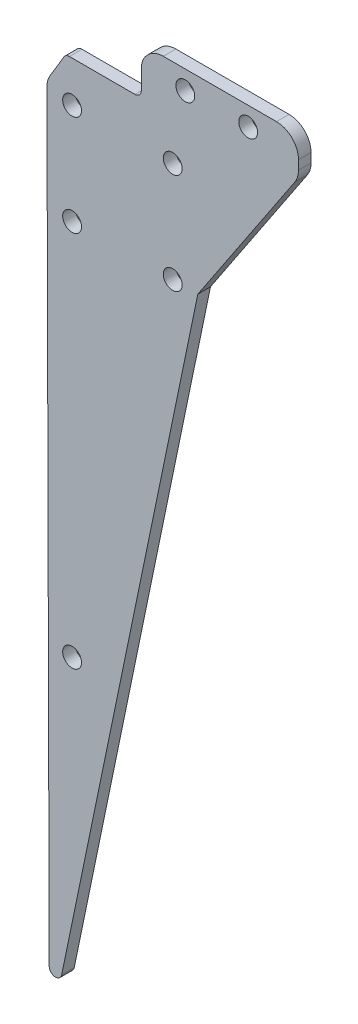
ISO-10303-21;
HEADER;
FILE_DESCRIPTION(('STEP AP214'),'2;1');
FILE_NAME('part.step','',(''),(''),'','','');
FILE_SCHEMA(('AUTOMOTIVE_DESIGN { 1 0 10303 214 1 1 1 1 }'));
ENDSEC;
DATA;
#1=APPLICATION_CONTEXT('core data for automotive mechanical design processes');
#2=APPLICATION_PROTOCOL_DEFINITION('international standard','automotive_design',2000,#1);
#3=PRODUCT_CONTEXT('',#1,'mechanical');
#4=PRODUCT('Part','Part','',(#3));
#5=PRODUCT_RELATED_PRODUCT_CATEGORY('part','',(#4));
#6=PRODUCT_DEFINITION_FORMATION('','',#4);
#7=PRODUCT_DEFINITION_CONTEXT('part definition',#1,'design');
#8=PRODUCT_DEFINITION('design','',#6,#7);
#9=PRODUCT_DEFINITION_SHAPE('','',#8);
#10=(LENGTH_UNIT() NAMED_UNIT(*) SI_UNIT(.MILLI.,.METRE.));
#11=(NAMED_UNIT(*) PLANE_ANGLE_UNIT() SI_UNIT($,.RADIAN.));
#12=(NAMED_UNIT(*) SI_UNIT($,.STERADIAN.) SOLID_ANGLE_UNIT());
#13=UNCERTAINTY_MEASURE_WITH_UNIT(LENGTH_MEASURE(1.E-05),#10,'distance_accuracy_value','');
#14=(GEOMETRIC_REPRESENTATION_CONTEXT(3) GLOBAL_UNCERTAINTY_ASSIGNED_CONTEXT((#13)) GLOBAL_UNIT_ASSIGNED_CONTEXT((#10,
#11,#12)) REPRESENTATION_CONTEXT('',''));
#15=CARTESIAN_POINT('',(0.,0.,0.));
#16=DIRECTION('',(0.,0.,1.));
#17=DIRECTION('',(1.,0.,0.));
#18=AXIS2_PLACEMENT_3D('',#15,#16,#17);
#19=CARTESIAN_POINT('',(0.,0.,2.));
#20=DIRECTION('',(0.,-1.,0.));
#21=DIRECTION('',(0.,0.,-1.));
#22=AXIS2_PLACEMENT_3D('',#19,#20,#21);
#23=PLANE('',#22);
#24=DIRECTION('',(-1.,0.,0.));
#25=VECTOR('',#24,1.);
#26=CARTESIAN_POINT('',(0.,0.,0.));
#27=LINE('',#26,#25);
#28=CARTESIAN_POINT('',(21.5,0.,0.));
#29=VERTEX_POINT('',#28);
#30=CARTESIAN_POINT('',(3.5,0.,0.));
#31=VERTEX_POINT('',#30);
#32=EDGE_CURVE('E317',#29,#31,#27,.T.);
#33=ORIENTED_EDGE('',*,*,#32,.T.);
#34=DIRECTION('',(0.,0.,-1.));
#35=VECTOR('',#34,1.);
#36=CARTESIAN_POINT('',(3.5,0.,2.));
#37=LINE('',#36,#35);
#38=CARTESIAN_POINT('',(3.5,0.,2.));
#39=VERTEX_POINT('',#38);
#40=EDGE_CURVE('E218',#31,#39,#37,.F.);
#41=ORIENTED_EDGE('',*,*,#40,.T.);
#42=DIRECTION('',(-1.,0.,0.));
#43=VECTOR('',#42,1.);
#44=CARTESIAN_POINT('',(0.,0.,2.));
#45=LINE('',#44,#43);
#46=CARTESIAN_POINT('',(21.5,0.,2.));
#47=VERTEX_POINT('',#46);
#48=EDGE_CURVE('E302',#47,#39,#45,.T.);
#49=ORIENTED_EDGE('',*,*,#48,.F.);
#50=DIRECTION('',(0.,0.,-1.));
#51=VECTOR('',#50,1.);
#52=CARTESIAN_POINT('',(21.5,0.,2.));
#53=LINE('',#52,#51);
#54=EDGE_CURVE('E349',#47,#29,#53,.T.);
#55=ORIENTED_EDGE('',*,*,#54,.T.);
#56=EDGE_LOOP('',(#33,#41,#49,#55));
#57=FACE_BOUND('',#56,.T.);
#58=ADVANCED_FACE('F39',(#57),#23,.F.);
#59=CARTESIAN_POINT('',(0.,0.,2.));
#60=DIRECTION('',(1.,0.,0.));
#61=DIRECTION('',(0.,1.,0.));
#62=AXIS2_PLACEMENT_3D('',#59,#60,#61);
#63=PLANE('',#62);
#64=DIRECTION('',(0.,-1.,0.));
#65=VECTOR('',#64,1.);
#66=CARTESIAN_POINT('',(0.,0.,0.));
#67=LINE('',#66,#65);
#68=CARTESIAN_POINT('',(0.,-3.5,0.));
#69=VERTEX_POINT('',#68);
#70=CARTESIAN_POINT('',(0.,-6.5,0.));
#71=VERTEX_POINT('',#70);
#72=EDGE_CURVE('E316',#69,#71,#67,.T.);
#73=ORIENTED_EDGE('',*,*,#72,.T.);
#74=DIRECTION('',(0.,0.,-1.));
#75=VECTOR('',#74,1.);
#76=CARTESIAN_POINT('',(0.,-6.5,2.));
#77=LINE('',#76,#75);
#78=CARTESIAN_POINT('',(0.,-6.5,2.));
#79=VERTEX_POINT('',#78);
#80=EDGE_CURVE('E198',#71,#79,#77,.F.);
#81=ORIENTED_EDGE('',*,*,#80,.T.);
#82=DIRECTION('',(0.,-1.,0.));
#83=VECTOR('',#82,1.);
#84=CARTESIAN_POINT('',(0.,0.,2.));
#85=LINE('',#84,#83);
#86=CARTESIAN_POINT('',(0.,-3.5,2.));
#87=VERTEX_POINT('',#86);
#88=EDGE_CURVE('E310',#87,#79,#85,.T.);
#89=ORIENTED_EDGE('',*,*,#88,.F.);
#90=DIRECTION('',(0.,0.,-1.));
#91=VECTOR('',#90,1.);
#92=CARTESIAN_POINT('',(0.,-3.5,2.));
#93=LINE('',#92,#91);
#94=EDGE_CURVE('E231',#87,#69,#93,.T.);
#95=ORIENTED_EDGE('',*,*,#94,.T.);
#96=EDGE_LOOP('',(#73,#81,#89,#95));
#97=FACE_BOUND('',#96,.T.);
#98=ADVANCED_FACE('F417',(#97),#63,.F.);
#99=CARTESIAN_POINT('',(0.,-7.5,2.));
#100=DIRECTION('',(0.,-1.,0.));
#101=DIRECTION('',(1.,0.,0.));
#102=AXIS2_PLACEMENT_3D('',#99,#100,#101);
#103=PLANE('',#102);
#104=DIRECTION('',(-1.,0.,0.));
#105=VECTOR('',#104,1.);
#106=CARTESIAN_POINT('',(0.,-7.5,2.));
#107=LINE('',#106,#105);
#108=CARTESIAN_POINT('',(-0.999999999999999,-7.5,2.));
#109=VERTEX_POINT('',#108);
#110=CARTESIAN_POINT('',(-11.4338096210309,-7.5,2.));
#111=VERTEX_POINT('',#110);
#112=EDGE_CURVE('E185',#109,#111,#107,.T.);
#113=ORIENTED_EDGE('',*,*,#112,.F.);
#114=DIRECTION('',(0.,0.,-1.));
#115=VECTOR('',#114,1.);
#116=CARTESIAN_POINT('',(-0.999999999999999,-7.5,0.));
#117=LINE('',#116,#115);
#118=CARTESIAN_POINT('',(-0.999999999999999,-7.5,0.));
#119=VERTEX_POINT('',#118);
#120=EDGE_CURVE('E204',#109,#119,#117,.T.);
#121=ORIENTED_EDGE('',*,*,#120,.T.);
#122=DIRECTION('',(-1.,0.,0.));
#123=VECTOR('',#122,1.);
#124=CARTESIAN_POINT('',(0.,-7.5,0.));
#125=LINE('',#124,#123);
#126=CARTESIAN_POINT('',(-11.4338096210309,-7.5,0.));
#127=VERTEX_POINT('',#126);
#128=EDGE_CURVE('E321',#119,#127,#125,.T.);
#129=ORIENTED_EDGE('',*,*,#128,.T.);
#130=DIRECTION('',(0.,0.,-1.));
#131=VECTOR('',#130,1.);
#132=CARTESIAN_POINT('',(-11.4338096210309,-7.5,2.));
#133=LINE('',#132,#131);
#134=EDGE_CURVE('E364',#127,#111,#133,.F.);
#135=ORIENTED_EDGE('',*,*,#134,.T.);
#136=EDGE_LOOP('',(#113,#121,#129,#135));
#137=FACE_BOUND('',#136,.T.);
#138=ADVANCED_FACE('F367',(#137),#103,.F.);
#139=CARTESIAN_POINT('',(-12.,-7.5,2.));
#140=DIRECTION('',(0.857492925712544,-0.514495755427527,0.));
#141=DIRECTION('',(0.514495755427527,0.857492925712544,0.));
#142=AXIS2_PLACEMENT_3D('',#139,#140,#141);
#143=PLANE('',#142);
#144=DIRECTION('',(-0.514495755427527,-0.857492925712544,0.));
#145=VECTOR('',#144,1.);
#146=CARTESIAN_POINT('',(-12.,-7.5,2.));
#147=LINE('',#146,#145);
#148=CARTESIAN_POINT('',(-12.2913025467435,-7.98550424457247,2.));
#149=VERTEX_POINT('',#148);
#150=CARTESIAN_POINT('',(-14.5012252399939,-11.6687087333232,2.));
#151=VERTEX_POINT('',#150);
#152=EDGE_CURVE('E177',#149,#151,#147,.T.);
#153=ORIENTED_EDGE('',*,*,#152,.F.);
#154=DIRECTION('',(0.,0.,-1.));
#155=VECTOR('',#154,1.);
#156=CARTESIAN_POINT('',(-12.2913025467435,-7.98550424457247,2.));
#157=LINE('',#156,#155);
#158=CARTESIAN_POINT('',(-12.2913025467435,-7.98550424457247,0.));
#159=VERTEX_POINT('',#158);
#160=EDGE_CURVE('E195',#149,#159,#157,.T.);
#161=ORIENTED_EDGE('',*,*,#160,.T.);
#162=DIRECTION('',(-0.514495755427527,-0.857492925712544,0.));
#163=VECTOR('',#162,1.);
#164=CARTESIAN_POINT('',(-12.,-7.5,0.));
#165=LINE('',#164,#163);
#166=CARTESIAN_POINT('',(-14.5012252399939,-11.6687087333232,0.));
#167=VERTEX_POINT('',#166);
#168=EDGE_CURVE('E245',#159,#167,#165,.T.);
#169=ORIENTED_EDGE('',*,*,#168,.T.);
#170=DIRECTION('',(0.,0.,-1.));
#171=VECTOR('',#170,1.);
#172=CARTESIAN_POINT('',(-14.5012252399939,-11.6687087333232,2.));
#173=LINE('',#172,#171);
#174=EDGE_CURVE('E194',#167,#151,#173,.F.);
#175=ORIENTED_EDGE('',*,*,#174,.T.);
#176=EDGE_LOOP('',(#153,#161,#169,#175));
#177=FACE_BOUND('',#176,.T.);
#178=ADVANCED_FACE('F193',(#177),#143,.F.);
#179=CARTESIAN_POINT('',(-15.,-16.,2.));
#180=DIRECTION('',(1.,0.,0.));
#181=DIRECTION('',(0.,1.,0.));
#182=AXIS2_PLACEMENT_3D('',#179,#180,#181);
#183=PLANE('',#182);
#184=DIRECTION('',(0.,1.,0.));
#185=VECTOR('',#184,1.);
#186=CARTESIAN_POINT('',(-15.,-16.,0.));
#187=LINE('',#186,#185);
#188=CARTESIAN_POINT('',(-15.,-13.4694438773195,0.));
#189=VERTEX_POINT('',#188);
#190=CARTESIAN_POINT('',(-15.,-14.0098482045068,0.));
#191=VERTEX_POINT('',#190);
#192=EDGE_CURVE('E241',#189,#191,#187,.F.);
#193=ORIENTED_EDGE('',*,*,#192,.T.);
#194=DIRECTION('',(0.,1.,0.));
#195=VECTOR('',#194,1.);
#196=CARTESIAN_POINT('',(-15.,-16.,0.));
#197=LINE('',#196,#195);
#198=CARTESIAN_POINT('',(-15.,-14.5502525316942,0.));
#199=VERTEX_POINT('',#198);
#200=EDGE_CURVE('E237',#191,#199,#197,.F.);
#201=ORIENTED_EDGE('',*,*,#200,.T.);
#202=CARTESIAN_POINT('',(-15.,-14.5502525316942,0.));
#203=DIRECTION('',(0.,0.,1.));
#204=VECTOR('',#203,1.);
#205=LINE('',#202,#204);
#206=CARTESIAN_POINT('',(-15.,-14.5502525316942,2.));
#207=VERTEX_POINT('',#206);
#208=EDGE_CURVE('E214',#199,#207,#205,.T.);
#209=ORIENTED_EDGE('',*,*,#208,.T.);
#210=DIRECTION('',(0.,1.,0.));
#211=VECTOR('',#210,1.);
#212=CARTESIAN_POINT('',(-15.,0.,2.));
#213=LINE('',#212,#211);
#214=CARTESIAN_POINT('',(-15.,-14.0098482045069,2.));
#215=VERTEX_POINT('',#214);
#216=EDGE_CURVE('E197',#215,#207,#213,.F.);
#217=ORIENTED_EDGE('',*,*,#216,.F.);
#218=DIRECTION('',(0.,1.,0.));
#219=VECTOR('',#218,1.);
#220=CARTESIAN_POINT('',(-15.,0.,2.));
#221=LINE('',#220,#219);
#222=CARTESIAN_POINT('',(-15.,-13.4694438773195,2.));
#223=VERTEX_POINT('',#222);
#224=EDGE_CURVE('E246',#223,#215,#221,.F.);
#225=ORIENTED_EDGE('',*,*,#224,.F.);
#226=DIRECTION('',(0.,0.,-1.));
#227=VECTOR('',#226,1.);
#228=CARTESIAN_POINT('',(-15.,-13.4694438773195,2.));
#229=LINE('',#228,#227);
#230=EDGE_CURVE('E215',#223,#189,#229,.T.);
#231=ORIENTED_EDGE('',*,*,#230,.T.);
#232=EDGE_LOOP('',(#193,#201,#209,#217,#225,#231));
#233=FACE_BOUND('',#232,.T.);
#234=ADVANCED_FACE('F382',(#233),#183,.F.);
#235=CARTESIAN_POINT('',(25.,-6.,2.));
#236=DIRECTION('',(-0.832050294337844,0.554700196225229,0.));
#237=DIRECTION('',(-0.554700196225229,-0.832050294337844,0.));
#238=AXIS2_PLACEMENT_3D('',#235,#236,#237);
#239=PLANE('',#238);
#240=DIRECTION('',(0.554700196225229,0.832050294337844,0.));
#241=VECTOR('',#240,1.);
#242=CARTESIAN_POINT('',(25.,-6.,2.));
#243=LINE('',#242,#241);
#244=CARTESIAN_POINT('',(9.00000000000012,-29.9999999999998,2.));
#245=VERTEX_POINT('',#244);
#246=CARTESIAN_POINT('',(24.4121760301825,-6.88173595472632,2.));
#247=VERTEX_POINT('',#246);
#248=EDGE_CURVE('E59',#245,#247,#243,.T.);
#249=ORIENTED_EDGE('',*,*,#248,.F.);
#250=DIRECTION('',(0.,0.,1.));
#251=VECTOR('',#250,1.);
#252=CARTESIAN_POINT('',(9.00000000000012,-29.9999999999998,-123.729146726626));
#253=LINE('',#252,#251);
#254=CARTESIAN_POINT('',(9.00000000000012,-29.9999999999998,0.));
#255=VERTEX_POINT('',#254);
#256=EDGE_CURVE('E276',#255,#245,#253,.T.);
#257=ORIENTED_EDGE('',*,*,#256,.F.);
#258=DIRECTION('',(0.554700196225229,0.832050294337844,0.));
#259=VECTOR('',#258,1.);
#260=CARTESIAN_POINT('',(25.,-6.,0.));
#261=LINE('',#260,#259);
#262=CARTESIAN_POINT('',(24.4121760301825,-6.88173595472632,0.));
#263=VERTEX_POINT('',#262);
#264=EDGE_CURVE('E255',#255,#263,#261,.T.);
#265=ORIENTED_EDGE('',*,*,#264,.T.);
#266=DIRECTION('',(0.,0.,-1.));
#267=VECTOR('',#266,1.);
#268=CARTESIAN_POINT('',(24.4121760301825,-6.88173595472632,2.));
#269=LINE('',#268,#267);
#270=EDGE_CURVE('E365',#263,#247,#269,.F.);
#271=ORIENTED_EDGE('',*,*,#270,.T.);
#272=EDGE_LOOP('',(#249,#257,#265,#271));
#273=FACE_BOUND('',#272,.T.);
#274=ADVANCED_FACE('F391',(#273),#239,.F.);
#275=CARTESIAN_POINT('',(25.,0.,2.));
#276=DIRECTION('',(-1.,0.,0.));
#277=DIRECTION('',(0.,0.,1.));
#278=AXIS2_PLACEMENT_3D('',#275,#276,#277);
#279=PLANE('',#278);
#280=DIRECTION('',(0.,1.,0.));
#281=VECTOR('',#280,1.);
#282=CARTESIAN_POINT('',(25.,0.,0.));
#283=LINE('',#282,#281);
#284=CARTESIAN_POINT('',(25.,-4.94028526793802,0.));
#285=VERTEX_POINT('',#284);
#286=CARTESIAN_POINT('',(25.,-3.5,0.));
#287=VERTEX_POINT('',#286);
#288=EDGE_CURVE('E308',#285,#287,#283,.T.);
#289=ORIENTED_EDGE('',*,*,#288,.T.);
#290=DIRECTION('',(0.,0.,-1.));
#291=VECTOR('',#290,1.);
#292=CARTESIAN_POINT('',(25.,-3.5,2.));
#293=LINE('',#292,#291);
#294=CARTESIAN_POINT('',(25.,-3.5,2.));
#295=VERTEX_POINT('',#294);
#296=EDGE_CURVE('E360',#287,#295,#293,.F.);
#297=ORIENTED_EDGE('',*,*,#296,.T.);
#298=DIRECTION('',(0.,1.,0.));
#299=VECTOR('',#298,1.);
#300=CARTESIAN_POINT('',(25.,0.,2.));
#301=LINE('',#300,#299);
#302=CARTESIAN_POINT('',(25.,-4.94028526793802,2.));
#303=VERTEX_POINT('',#302);
#304=EDGE_CURVE('E312',#303,#295,#301,.T.);
#305=ORIENTED_EDGE('',*,*,#304,.F.);
#306=DIRECTION('',(0.,0.,-1.));
#307=VECTOR('',#306,1.);
#308=CARTESIAN_POINT('',(25.,-4.94028526793802,2.));
#309=LINE('',#308,#307);
#310=EDGE_CURVE('E358',#303,#285,#309,.T.);
#311=ORIENTED_EDGE('',*,*,#310,.T.);
#312=EDGE_LOOP('',(#289,#297,#305,#311));
#313=FACE_BOUND('',#312,.T.);
#314=ADVANCED_FACE('F402',(#313),#279,.F.);
#315=CARTESIAN_POINT('',(0.,0.,2.));
#316=DIRECTION('',(0.,0.,-1.));
#317=DIRECTION('',(-1.,0.,0.));
#318=AXIS2_PLACEMENT_3D('',#315,#316,#317);
#319=PLANE('',#318);
#320=DIRECTION('',(0.202790603964184,0.979222125436227,0.));
#321=VECTOR('',#320,1.);
#322=CARTESIAN_POINT('',(9.00000000000012,-29.9999999999998,2.));
#323=LINE('',#322,#321);
#324=CARTESIAN_POINT('',(-12.6602898952585,-134.591804029274,2.));
#325=VERTEX_POINT('',#324);
#326=EDGE_CURVE('E256',#325,#245,#323,.T.);
#327=ORIENTED_EDGE('',*,*,#326,.T.);
#328=ORIENTED_EDGE('',*,*,#248,.T.);
#329=CARTESIAN_POINT('',(21.5,-4.94028526793802,2.));
#330=DIRECTION('',(0.,0.,-1.));
#331=DIRECTION('',(-1.,0.,0.));
#332=AXIS2_PLACEMENT_3D('',#329,#330,#331);
#333=CIRCLE('',#332,3.5);
#334=EDGE_CURVE('E213',#247,#303,#333,.F.);
#335=ORIENTED_EDGE('',*,*,#334,.T.);
#336=ORIENTED_EDGE('',*,*,#304,.T.);
#337=CARTESIAN_POINT('',(21.5,-3.5,2.));
#338=DIRECTION('',(0.,0.,-1.));
#339=DIRECTION('',(-1.,0.,0.));
#340=AXIS2_PLACEMENT_3D('',#337,#338,#339);
#341=CIRCLE('',#340,3.5);
#342=EDGE_CURVE('E208',#295,#47,#341,.F.);
#343=ORIENTED_EDGE('',*,*,#342,.T.);
#344=ORIENTED_EDGE('',*,*,#48,.T.);
#345=CARTESIAN_POINT('',(3.5,-3.5,2.));
#346=DIRECTION('',(0.,0.,-1.));
#347=DIRECTION('',(-1.,0.,0.));
#348=AXIS2_PLACEMENT_3D('',#345,#346,#347);
#349=CIRCLE('',#348,3.5);
#350=EDGE_CURVE('E351',#39,#87,#349,.F.);
#351=ORIENTED_EDGE('',*,*,#350,.T.);
#352=ORIENTED_EDGE('',*,*,#88,.T.);
#353=CARTESIAN_POINT('',(-0.999999999999999,-6.5,2.));
#354=DIRECTION('',(0.,0.,-1.));
#355=DIRECTION('',(-1.,0.,0.));
#356=AXIS2_PLACEMENT_3D('',#353,#354,#355);
#357=CIRCLE('',#356,1.);
#358=EDGE_CURVE('E47',#79,#109,#357,.T.);
#359=ORIENTED_EDGE('',*,*,#358,.T.);
#360=ORIENTED_EDGE('',*,*,#112,.T.);
#361=CARTESIAN_POINT('',(-11.4338096210309,-8.5,2.));
#362=DIRECTION('',(0.,0.,-1.));
#363=DIRECTION('',(-1.,0.,0.));
#364=AXIS2_PLACEMENT_3D('',#361,#362,#363);
#365=CIRCLE('',#364,1.);
#366=EDGE_CURVE('E172',#111,#149,#365,.F.);
#367=ORIENTED_EDGE('',*,*,#366,.T.);
#368=ORIENTED_EDGE('',*,*,#152,.T.);
#369=CARTESIAN_POINT('',(-11.5,-13.4694438773195,2.));
#370=DIRECTION('',(0.,0.,-1.));
#371=DIRECTION('',(-1.,0.,0.));
#372=AXIS2_PLACEMENT_3D('',#369,#370,#371);
#373=CIRCLE('',#372,3.5);
#374=EDGE_CURVE('E206',#151,#223,#373,.F.);
#375=ORIENTED_EDGE('',*,*,#374,.T.);
#376=ORIENTED_EDGE('',*,*,#224,.T.);
#377=ORIENTED_EDGE('',*,*,#216,.T.);
#378=CARTESIAN_POINT('',(-11.5,-14.5502525316942,2.));
#379=DIRECTION('',(0.,0.,-1.));
#380=DIRECTION('',(-1.,0.,0.));
#381=AXIS2_PLACEMENT_3D('',#378,#379,#380);
#382=CIRCLE('',#381,3.5);
#383=CARTESIAN_POINT('',(-14.9980301294732,-14.6676629796873,2.));
#384=VERTEX_POINT('',#383);
#385=EDGE_CURVE('E216',#207,#384,#382,.F.);
#386=ORIENTED_EDGE('',*,*,#385,.T.);
#387=DIRECTION('',(0.00299455373895461,-0.999995516313901,0.));
#388=VECTOR('',#387,1.);
#389=CARTESIAN_POINT('',(-15.,-14.0098482045069,2.));
#390=LINE('',#389,#388);
#391=CARTESIAN_POINT('',(-14.6395075370087,-134.392007979048,2.));
#392=VERTEX_POINT('',#391);
#393=EDGE_CURVE('E254',#384,#392,#390,.T.);
#394=ORIENTED_EDGE('',*,*,#393,.T.);
#395=CARTESIAN_POINT('',(-13.6395120206948,-134.38901342531,2.));
#396=DIRECTION('',(0.,0.,1.));
#397=DIRECTION('',(-1.,0.,0.));
#398=AXIS2_PLACEMENT_3D('',#395,#396,#397);
#399=CIRCLE('',#398,1.);
#400=EDGE_CURVE('E251',#392,#325,#399,.T.);
#401=ORIENTED_EDGE('',*,*,#400,.T.);
#402=EDGE_LOOP('',(#327,#328,#335,#336,#343,#344,#351,#352,#359,#360,#367,#368,#375,#376,#377,
#386,#394,#401));
#403=FACE_BOUND('',#402,.T.);
#404=CARTESIAN_POINT('',(5.,-30.,2.));
#405=DIRECTION('',(0.,0.,1.));
#406=DIRECTION('',(1.,0.,0.));
#407=AXIS2_PLACEMENT_3D('',#404,#405,#406);
#408=CIRCLE('',#407,1.5);
#409=CARTESIAN_POINT('',(6.5,-30.,2.));
#410=VERTEX_POINT('',#409);
#411=EDGE_CURVE('E289',#410,#410,#408,.T.);
#412=ORIENTED_EDGE('',*,*,#411,.F.);
#413=EDGE_LOOP('',(#412));
#414=FACE_BOUND('',#413,.T.);
#415=CARTESIAN_POINT('',(-10.9999999999999,-90.,2.));
#416=DIRECTION('',(0.,0.,1.));
#417=DIRECTION('',(1.,0.,0.));
#418=AXIS2_PLACEMENT_3D('',#415,#416,#417);
#419=CIRCLE('',#418,1.5);
#420=CARTESIAN_POINT('',(-9.49999999999994,-90.,2.));
#421=VERTEX_POINT('',#420);
#422=EDGE_CURVE('E253',#421,#421,#419,.T.);
#423=ORIENTED_EDGE('',*,*,#422,.F.);
#424=EDGE_LOOP('',(#423));
#425=FACE_BOUND('',#424,.T.);
#426=CARTESIAN_POINT('',(-10.9999999999999,-30.0000000000002,2.));
#427=DIRECTION('',(0.,0.,1.));
#428=DIRECTION('',(1.,0.,0.));
#429=AXIS2_PLACEMENT_3D('',#426,#427,#428);
#430=CIRCLE('',#429,1.5);
#431=CARTESIAN_POINT('',(-9.49999999999994,-30.0000000000002,2.));
#432=VERTEX_POINT('',#431);
#433=EDGE_CURVE('E261',#432,#432,#430,.T.);
#434=ORIENTED_EDGE('',*,*,#433,.F.);
#435=EDGE_LOOP('',(#434));
#436=FACE_BOUND('',#435,.T.);
#437=CARTESIAN_POINT('',(7.,-3.,2.));
#438=DIRECTION('',(0.,0.,1.));
#439=DIRECTION('',(1.,0.,0.));
#440=AXIS2_PLACEMENT_3D('',#437,#438,#439);
#441=CIRCLE('',#440,1.5);
#442=CARTESIAN_POINT('',(8.50000000000001,-3.,2.));
#443=VERTEX_POINT('',#442);
#444=EDGE_CURVE('E297',#443,#443,#441,.T.);
#445=ORIENTED_EDGE('',*,*,#444,.F.);
#446=EDGE_LOOP('',(#445));
#447=FACE_BOUND('',#446,.T.);
#448=CARTESIAN_POINT('',(17.,-3.,2.));
#449=DIRECTION('',(0.,0.,1.));
#450=DIRECTION('',(1.,0.,0.));
#451=AXIS2_PLACEMENT_3D('',#448,#449,#450);
#452=CIRCLE('',#451,1.5);
#453=CARTESIAN_POINT('',(18.5,-3.,2.));
#454=VERTEX_POINT('',#453);
#455=EDGE_CURVE('E298',#454,#454,#452,.T.);
#456=ORIENTED_EDGE('',*,*,#455,.F.);
#457=EDGE_LOOP('',(#456));
#458=FACE_BOUND('',#457,.T.);
#459=CARTESIAN_POINT('',(-11.,-14.,2.));
#460=DIRECTION('',(0.,0.,1.));
#461=DIRECTION('',(1.,0.,0.));
#462=AXIS2_PLACEMENT_3D('',#459,#460,#461);
#463=CIRCLE('',#462,1.5);
#464=CARTESIAN_POINT('',(-9.49999999999999,-14.,2.));
#465=VERTEX_POINT('',#464);
#466=EDGE_CURVE('E271',#465,#465,#463,.T.);
#467=ORIENTED_EDGE('',*,*,#466,.F.);
#468=EDGE_LOOP('',(#467));
#469=FACE_BOUND('',#468,.T.);
#470=CARTESIAN_POINT('',(5.,-14.,2.));
#471=DIRECTION('',(0.,0.,1.));
#472=DIRECTION('',(1.,0.,0.));
#473=AXIS2_PLACEMENT_3D('',#470,#471,#472);
#474=CIRCLE('',#473,1.5);
#475=CARTESIAN_POINT('',(6.5,-14.,2.));
#476=VERTEX_POINT('',#475);
#477=EDGE_CURVE('E293',#476,#476,#474,.T.);
#478=ORIENTED_EDGE('',*,*,#477,.F.);
#479=EDGE_LOOP('',(#478));
#480=FACE_BOUND('',#479,.T.);
#481=ADVANCED_FACE('F180',(#403,#414,#425,#436,#447,#458,#469,#480),#319,.F.);
#482=CARTESIAN_POINT('',(0.,0.,0.));
#483=DIRECTION('',(0.,0.,-1.));
#484=DIRECTION('',(-1.,0.,0.));
#485=AXIS2_PLACEMENT_3D('',#482,#483,#484);
#486=PLANE('',#485);
#487=ORIENTED_EDGE('',*,*,#264,.F.);
#488=DIRECTION('',(0.202790603964183,0.979222125436227,0.));
#489=VECTOR('',#488,1.);
#490=CARTESIAN_POINT('',(9.00000000000012,-29.9999999999998,0.));
#491=LINE('',#490,#489);
#492=CARTESIAN_POINT('',(-12.6602898952585,-134.591804029274,0.));
#493=VERTEX_POINT('',#492);
#494=EDGE_CURVE('E110',#493,#255,#491,.T.);
#495=ORIENTED_EDGE('',*,*,#494,.F.);
#496=CARTESIAN_POINT('',(-13.6395120206948,-134.38901342531,0.));
#497=DIRECTION('',(0.,0.,-1.));
#498=DIRECTION('',(-1.,0.,0.));
#499=AXIS2_PLACEMENT_3D('',#496,#497,#498);
#500=CIRCLE('',#499,1.);
#501=CARTESIAN_POINT('',(-14.6395075370087,-134.392007979048,0.));
#502=VERTEX_POINT('',#501);
#503=EDGE_CURVE('E279',#502,#493,#500,.F.);
#504=ORIENTED_EDGE('',*,*,#503,.F.);
#505=DIRECTION('',(0.00299455373895461,-0.999995516313901,0.));
#506=VECTOR('',#505,1.);
#507=CARTESIAN_POINT('',(-14.6395075370087,-134.392007979048,0.));
#508=LINE('',#507,#506);
#509=CARTESIAN_POINT('',(-14.9980301294732,-14.6676629796873,0.));
#510=VERTEX_POINT('',#509);
#511=EDGE_CURVE('E43',#510,#502,#508,.T.);
#512=ORIENTED_EDGE('',*,*,#511,.F.);
#513=CARTESIAN_POINT('',(-11.5,-14.5502525316942,0.));
#514=DIRECTION('',(0.,0.,-1.));
#515=DIRECTION('',(-1.,0.,0.));
#516=AXIS2_PLACEMENT_3D('',#513,#514,#515);
#517=CIRCLE('',#516,3.5);
#518=EDGE_CURVE('E95',#510,#199,#517,.T.);
#519=ORIENTED_EDGE('',*,*,#518,.T.);
#520=ORIENTED_EDGE('',*,*,#200,.F.);
#521=ORIENTED_EDGE('',*,*,#192,.F.);
#522=CARTESIAN_POINT('',(-11.5,-13.4694438773195,0.));
#523=DIRECTION('',(0.,0.,-1.));
#524=DIRECTION('',(-1.,0.,0.));
#525=AXIS2_PLACEMENT_3D('',#522,#523,#524);
#526=CIRCLE('',#525,3.5);
#527=EDGE_CURVE('E224',#189,#167,#526,.T.);
#528=ORIENTED_EDGE('',*,*,#527,.T.);
#529=ORIENTED_EDGE('',*,*,#168,.F.);
#530=CARTESIAN_POINT('',(-11.4338096210309,-8.5,0.));
#531=DIRECTION('',(0.,0.,-1.));
#532=DIRECTION('',(-1.,0.,0.));
#533=AXIS2_PLACEMENT_3D('',#530,#531,#532);
#534=CIRCLE('',#533,1.);
#535=EDGE_CURVE('E190',#159,#127,#534,.T.);
#536=ORIENTED_EDGE('',*,*,#535,.T.);
#537=ORIENTED_EDGE('',*,*,#128,.F.);
#538=CARTESIAN_POINT('',(-0.999999999999999,-6.5,0.));
#539=DIRECTION('',(0.,0.,-1.));
#540=DIRECTION('',(-1.,0.,0.));
#541=AXIS2_PLACEMENT_3D('',#538,#539,#540);
#542=CIRCLE('',#541,1.);
#543=EDGE_CURVE('E187',#119,#71,#542,.F.);
#544=ORIENTED_EDGE('',*,*,#543,.T.);
#545=ORIENTED_EDGE('',*,*,#72,.F.);
#546=CARTESIAN_POINT('',(3.5,-3.5,0.));
#547=DIRECTION('',(0.,0.,-1.));
#548=DIRECTION('',(-1.,0.,0.));
#549=AXIS2_PLACEMENT_3D('',#546,#547,#548);
#550=CIRCLE('',#549,3.5);
#551=EDGE_CURVE('E346',#69,#31,#550,.T.);
#552=ORIENTED_EDGE('',*,*,#551,.T.);
#553=ORIENTED_EDGE('',*,*,#32,.F.);
#554=CARTESIAN_POINT('',(21.5,-3.5,0.));
#555=DIRECTION('',(0.,0.,-1.));
#556=DIRECTION('',(-1.,0.,0.));
#557=AXIS2_PLACEMENT_3D('',#554,#555,#556);
#558=CIRCLE('',#557,3.5);
#559=EDGE_CURVE('E223',#29,#287,#558,.T.);
#560=ORIENTED_EDGE('',*,*,#559,.T.);
#561=ORIENTED_EDGE('',*,*,#288,.F.);
#562=CARTESIAN_POINT('',(21.5,-4.94028526793802,0.));
#563=DIRECTION('',(0.,0.,-1.));
#564=DIRECTION('',(-1.,0.,0.));
#565=AXIS2_PLACEMENT_3D('',#562,#563,#564);
#566=CIRCLE('',#565,3.5);
#567=EDGE_CURVE('E228',#285,#263,#566,.T.);
#568=ORIENTED_EDGE('',*,*,#567,.T.);
#569=EDGE_LOOP('',(#487,#495,#504,#512,#519,#520,#521,#528,#529,#536,#537,#544,#545,#552,#553,
#560,#561,#568));
#570=FACE_BOUND('',#569,.T.);
#571=CARTESIAN_POINT('',(5.,-30.,0.));
#572=DIRECTION('',(0.,0.,-1.));
#573=DIRECTION('',(-1.,0.,0.));
#574=AXIS2_PLACEMENT_3D('',#571,#572,#573);
#575=CIRCLE('',#574,1.5);
#576=CARTESIAN_POINT('',(3.5,-30.,0.));
#577=VERTEX_POINT('',#576);
#578=EDGE_CURVE('E303',#577,#577,#575,.T.);
#579=ORIENTED_EDGE('',*,*,#578,.F.);
#580=EDGE_LOOP('',(#579));
#581=FACE_BOUND('',#580,.T.);
#582=CARTESIAN_POINT('',(-10.9999999999999,-90.,0.));
#583=DIRECTION('',(0.,0.,-1.));
#584=DIRECTION('',(-1.,0.,0.));
#585=AXIS2_PLACEMENT_3D('',#582,#583,#584);
#586=CIRCLE('',#585,1.5);
#587=CARTESIAN_POINT('',(-12.4999999999999,-90.,0.));
#588=VERTEX_POINT('',#587);
#589=EDGE_CURVE('E274',#588,#588,#586,.F.);
#590=ORIENTED_EDGE('',*,*,#589,.T.);
#591=EDGE_LOOP('',(#590));
#592=FACE_BOUND('',#591,.T.);
#593=CARTESIAN_POINT('',(-10.9999999999999,-30.0000000000002,0.));
#594=DIRECTION('',(0.,0.,-1.));
#595=DIRECTION('',(-1.,0.,0.));
#596=AXIS2_PLACEMENT_3D('',#593,#594,#595);
#597=CIRCLE('',#596,1.5);
#598=CARTESIAN_POINT('',(-12.4999999999999,-30.0000000000002,0.));
#599=VERTEX_POINT('',#598);
#600=EDGE_CURVE('E268',#599,#599,#597,.F.);
#601=ORIENTED_EDGE('',*,*,#600,.T.);
#602=EDGE_LOOP('',(#601));
#603=FACE_BOUND('',#602,.T.);
#604=CARTESIAN_POINT('',(7.,-3.,0.));
#605=DIRECTION('',(0.,0.,-1.));
#606=DIRECTION('',(-1.,0.,0.));
#607=AXIS2_PLACEMENT_3D('',#604,#605,#606);
#608=CIRCLE('',#607,1.5);
#609=CARTESIAN_POINT('',(5.5,-3.,0.));
#610=VERTEX_POINT('',#609);
#611=EDGE_CURVE('E299',#610,#610,#608,.T.);
#612=ORIENTED_EDGE('',*,*,#611,.F.);
#613=EDGE_LOOP('',(#612));
#614=FACE_BOUND('',#613,.T.);
#615=CARTESIAN_POINT('',(17.,-3.,0.));
#616=DIRECTION('',(0.,0.,-1.));
#617=DIRECTION('',(-1.,0.,0.));
#618=AXIS2_PLACEMENT_3D('',#615,#616,#617);
#619=CIRCLE('',#618,1.5);
#620=CARTESIAN_POINT('',(15.5,-3.,0.));
#621=VERTEX_POINT('',#620);
#622=EDGE_CURVE('E318',#621,#621,#619,.T.);
#623=ORIENTED_EDGE('',*,*,#622,.F.);
#624=EDGE_LOOP('',(#623));
#625=FACE_BOUND('',#624,.T.);
#626=CARTESIAN_POINT('',(-11.,-14.,0.));
#627=DIRECTION('',(0.,0.,-1.));
#628=DIRECTION('',(-1.,0.,0.));
#629=AXIS2_PLACEMENT_3D('',#626,#627,#628);
#630=CIRCLE('',#629,1.5);
#631=CARTESIAN_POINT('',(-12.5,-14.,0.));
#632=VERTEX_POINT('',#631);
#633=EDGE_CURVE('E288',#632,#632,#630,.T.);
#634=ORIENTED_EDGE('',*,*,#633,.F.);
#635=EDGE_LOOP('',(#634));
#636=FACE_BOUND('',#635,.T.);
#637=CARTESIAN_POINT('',(5.,-14.,0.));
#638=DIRECTION('',(0.,0.,-1.));
#639=DIRECTION('',(-1.,0.,0.));
#640=AXIS2_PLACEMENT_3D('',#637,#638,#639);
#641=CIRCLE('',#640,1.5);
#642=CARTESIAN_POINT('',(3.5,-14.,0.));
#643=VERTEX_POINT('',#642);
#644=EDGE_CURVE('E337',#643,#643,#641,.T.);
#645=ORIENTED_EDGE('',*,*,#644,.F.);
#646=EDGE_LOOP('',(#645));
#647=FACE_BOUND('',#646,.T.);
#648=ADVANCED_FACE('F375',(#570,#581,#592,#603,#614,#625,#636,#647),#486,.T.);
#649=CARTESIAN_POINT('',(7.,-3.,-3.));
#650=DIRECTION('',(0.,0.,1.));
#651=DIRECTION('',(1.,0.,0.));
#652=AXIS2_PLACEMENT_3D('',#649,#650,#651);
#653=CYLINDRICAL_SURFACE('',#652,1.5);
#654=ORIENTED_EDGE('',*,*,#611,.T.);
#655=EDGE_LOOP('',(#654));
#656=FACE_BOUND('',#655,.T.);
#657=ORIENTED_EDGE('',*,*,#444,.T.);
#658=EDGE_LOOP('',(#657));
#659=FACE_BOUND('',#658,.T.);
#660=ADVANCED_FACE('F514',(#656,#659),#653,.F.);
#661=CARTESIAN_POINT('',(17.,-3.,-3.));
#662=DIRECTION('',(0.,0.,1.));
#663=DIRECTION('',(1.,0.,0.));
#664=AXIS2_PLACEMENT_3D('',#661,#662,#663);
#665=CYLINDRICAL_SURFACE('',#664,1.5);
#666=ORIENTED_EDGE('',*,*,#622,.T.);
#667=EDGE_LOOP('',(#666));
#668=FACE_BOUND('',#667,.T.);
#669=ORIENTED_EDGE('',*,*,#455,.T.);
#670=EDGE_LOOP('',(#669));
#671=FACE_BOUND('',#670,.T.);
#672=ADVANCED_FACE('F523',(#668,#671),#665,.F.);
#673=CARTESIAN_POINT('',(-11.,-14.,-8.));
#674=DIRECTION('',(0.,0.,1.));
#675=DIRECTION('',(1.,0.,0.));
#676=AXIS2_PLACEMENT_3D('',#673,#674,#675);
#677=CYLINDRICAL_SURFACE('',#676,1.5);
#678=ORIENTED_EDGE('',*,*,#633,.T.);
#679=EDGE_LOOP('',(#678));
#680=FACE_BOUND('',#679,.T.);
#681=ORIENTED_EDGE('',*,*,#466,.T.);
#682=EDGE_LOOP('',(#681));
#683=FACE_BOUND('',#682,.T.);
#684=ADVANCED_FACE('F534',(#680,#683),#677,.F.);
#685=CARTESIAN_POINT('',(5.,-14.,-8.));
#686=DIRECTION('',(0.,0.,1.));
#687=DIRECTION('',(1.,0.,0.));
#688=AXIS2_PLACEMENT_3D('',#685,#686,#687);
#689=CYLINDRICAL_SURFACE('',#688,1.5);
#690=ORIENTED_EDGE('',*,*,#644,.T.);
#691=EDGE_LOOP('',(#690));
#692=FACE_BOUND('',#691,.T.);
#693=ORIENTED_EDGE('',*,*,#477,.T.);
#694=EDGE_LOOP('',(#693));
#695=FACE_BOUND('',#694,.T.);
#696=ADVANCED_FACE('F543',(#692,#695),#689,.F.);
#697=CARTESIAN_POINT('',(5.,-30.,-8.));
#698=DIRECTION('',(0.,0.,1.));
#699=DIRECTION('',(1.,0.,0.));
#700=AXIS2_PLACEMENT_3D('',#697,#698,#699);
#701=CYLINDRICAL_SURFACE('',#700,1.5);
#702=ORIENTED_EDGE('',*,*,#578,.T.);
#703=EDGE_LOOP('',(#702));
#704=FACE_BOUND('',#703,.T.);
#705=ORIENTED_EDGE('',*,*,#411,.T.);
#706=EDGE_LOOP('',(#705));
#707=FACE_BOUND('',#706,.T.);
#708=ADVANCED_FACE('F438',(#704,#707),#701,.F.);
#709=CARTESIAN_POINT('',(3.5,-3.5,2.));
#710=DIRECTION('',(0.,0.,-1.));
#711=DIRECTION('',(-1.,0.,0.));
#712=AXIS2_PLACEMENT_3D('',#709,#710,#711);
#713=CYLINDRICAL_SURFACE('',#712,3.5);
#714=ORIENTED_EDGE('',*,*,#350,.F.);
#715=ORIENTED_EDGE('',*,*,#40,.F.);
#716=ORIENTED_EDGE('',*,*,#551,.F.);
#717=ORIENTED_EDGE('',*,*,#94,.F.);
#718=EDGE_LOOP('',(#714,#715,#716,#717));
#719=FACE_BOUND('',#718,.T.);
#720=ADVANCED_FACE('F412',(#719),#713,.T.);
#721=CARTESIAN_POINT('',(21.5,-3.5,2.));
#722=DIRECTION('',(0.,0.,-1.));
#723=DIRECTION('',(-1.,0.,0.));
#724=AXIS2_PLACEMENT_3D('',#721,#722,#723);
#725=CYLINDRICAL_SURFACE('',#724,3.5);
#726=ORIENTED_EDGE('',*,*,#342,.F.);
#727=ORIENTED_EDGE('',*,*,#296,.F.);
#728=ORIENTED_EDGE('',*,*,#559,.F.);
#729=ORIENTED_EDGE('',*,*,#54,.F.);
#730=EDGE_LOOP('',(#726,#727,#728,#729));
#731=FACE_BOUND('',#730,.T.);
#732=ADVANCED_FACE('F404',(#731),#725,.T.);
#733=CARTESIAN_POINT('',(-11.5,-13.4694438773195,2.));
#734=DIRECTION('',(0.,0.,-1.));
#735=DIRECTION('',(-1.,0.,0.));
#736=AXIS2_PLACEMENT_3D('',#733,#734,#735);
#737=CYLINDRICAL_SURFACE('',#736,3.5);
#738=ORIENTED_EDGE('',*,*,#374,.F.);
#739=ORIENTED_EDGE('',*,*,#174,.F.);
#740=ORIENTED_EDGE('',*,*,#527,.F.);
#741=ORIENTED_EDGE('',*,*,#230,.F.);
#742=EDGE_LOOP('',(#738,#739,#740,#741));
#743=FACE_BOUND('',#742,.T.);
#744=ADVANCED_FACE('F377',(#743),#737,.T.);
#745=CARTESIAN_POINT('',(21.5,-4.94028526793802,2.));
#746=DIRECTION('',(0.,0.,-1.));
#747=DIRECTION('',(-1.,0.,0.));
#748=AXIS2_PLACEMENT_3D('',#745,#746,#747);
#749=CYLINDRICAL_SURFACE('',#748,3.5);
#750=ORIENTED_EDGE('',*,*,#334,.F.);
#751=ORIENTED_EDGE('',*,*,#270,.F.);
#752=ORIENTED_EDGE('',*,*,#567,.F.);
#753=ORIENTED_EDGE('',*,*,#310,.F.);
#754=EDGE_LOOP('',(#750,#751,#752,#753));
#755=FACE_BOUND('',#754,.T.);
#756=ADVANCED_FACE('F399',(#755),#749,.T.);
#757=CARTESIAN_POINT('',(-11.5,-14.5502525316942,2.));
#758=DIRECTION('',(0.,0.,-1.));
#759=DIRECTION('',(-1.,0.,0.));
#760=AXIS2_PLACEMENT_3D('',#757,#758,#759);
#761=CYLINDRICAL_SURFACE('',#760,3.5);
#762=DIRECTION('',(0.,0.,-1.));
#763=VECTOR('',#762,1.);
#764=CARTESIAN_POINT('',(-14.9980301294732,-14.6676629796873,2.));
#765=LINE('',#764,#763);
#766=EDGE_CURVE('E11',#384,#510,#765,.T.);
#767=ORIENTED_EDGE('',*,*,#766,.F.);
#768=ORIENTED_EDGE('',*,*,#385,.F.);
#769=ORIENTED_EDGE('',*,*,#208,.F.);
#770=ORIENTED_EDGE('',*,*,#518,.F.);
#771=EDGE_LOOP('',(#767,#768,#769,#770));
#772=FACE_BOUND('',#771,.T.);
#773=ADVANCED_FACE('F418',(#772),#761,.T.);
#774=CARTESIAN_POINT('',(-0.999999999999999,-6.5,2.));
#775=DIRECTION('',(0.,0.,1.));
#776=DIRECTION('',(1.,0.,0.));
#777=AXIS2_PLACEMENT_3D('',#774,#775,#776);
#778=CYLINDRICAL_SURFACE('',#777,1.);
#779=ORIENTED_EDGE('',*,*,#358,.F.);
#780=ORIENTED_EDGE('',*,*,#80,.F.);
#781=ORIENTED_EDGE('',*,*,#543,.F.);
#782=ORIENTED_EDGE('',*,*,#120,.F.);
#783=EDGE_LOOP('',(#779,#780,#781,#782));
#784=FACE_BOUND('',#783,.T.);
#785=ADVANCED_FACE('F420',(#784),#778,.F.);
#786=CARTESIAN_POINT('',(-11.4338096210309,-8.5,2.));
#787=DIRECTION('',(0.,0.,-1.));
#788=DIRECTION('',(-1.,0.,0.));
#789=AXIS2_PLACEMENT_3D('',#786,#787,#788);
#790=CYLINDRICAL_SURFACE('',#789,1.);
#791=ORIENTED_EDGE('',*,*,#366,.F.);
#792=ORIENTED_EDGE('',*,*,#134,.F.);
#793=ORIENTED_EDGE('',*,*,#535,.F.);
#794=ORIENTED_EDGE('',*,*,#160,.F.);
#795=EDGE_LOOP('',(#791,#792,#793,#794));
#796=FACE_BOUND('',#795,.T.);
#797=ADVANCED_FACE('F41',(#796),#790,.T.);
#798=CARTESIAN_POINT('',(9.00000000000012,-29.9999999999998,-123.729146726626));
#799=DIRECTION('',(0.979222125436227,-0.202790603964183,0.));
#800=DIRECTION('',(0.202790603964183,0.979222125436227,0.));
#801=AXIS2_PLACEMENT_3D('',#798,#799,#800);
#802=PLANE('',#801);
#803=DIRECTION('',(0.,0.,1.));
#804=VECTOR('',#803,1.);
#805=CARTESIAN_POINT('',(-12.6602898952585,-134.591804029274,-123.729146726626));
#806=LINE('',#805,#804);
#807=EDGE_CURVE('E281',#493,#325,#806,.T.);
#808=ORIENTED_EDGE('',*,*,#807,.F.);
#809=ORIENTED_EDGE('',*,*,#494,.T.);
#810=ORIENTED_EDGE('',*,*,#256,.T.);
#811=ORIENTED_EDGE('',*,*,#326,.F.);
#812=EDGE_LOOP('',(#808,#809,#810,#811));
#813=FACE_BOUND('',#812,.T.);
#814=ADVANCED_FACE('F389',(#813),#802,.T.);
#815=CARTESIAN_POINT('',(-13.6395120206948,-134.38901342531,-123.729146726626));
#816=DIRECTION('',(0.,0.,1.));
#817=DIRECTION('',(1.,0.,0.));
#818=AXIS2_PLACEMENT_3D('',#815,#816,#817);
#819=CYLINDRICAL_SURFACE('',#818,1.);
#820=DIRECTION('',(0.,0.,1.));
#821=VECTOR('',#820,1.);
#822=CARTESIAN_POINT('',(-14.6395075370087,-134.392007979048,-123.729146726626));
#823=LINE('',#822,#821);
#824=EDGE_CURVE('E267',#502,#392,#823,.T.);
#825=ORIENTED_EDGE('',*,*,#824,.F.);
#826=ORIENTED_EDGE('',*,*,#503,.T.);
#827=ORIENTED_EDGE('',*,*,#807,.T.);
#828=ORIENTED_EDGE('',*,*,#400,.F.);
#829=EDGE_LOOP('',(#825,#826,#827,#828));
#830=FACE_BOUND('',#829,.T.);
#831=ADVANCED_FACE('F390',(#830),#819,.T.);
#832=CARTESIAN_POINT('',(-14.6395075370087,-134.392007979048,-123.729146726626));
#833=DIRECTION('',(-0.999995516313901,-0.00299455373895461,0.));
#834=DIRECTION('',(0.00299455373895461,-0.999995516313901,0.));
#835=AXIS2_PLACEMENT_3D('',#832,#833,#834);
#836=PLANE('',#835);
#837=ORIENTED_EDGE('',*,*,#393,.F.);
#838=ORIENTED_EDGE('',*,*,#766,.T.);
#839=ORIENTED_EDGE('',*,*,#511,.T.);
#840=ORIENTED_EDGE('',*,*,#824,.T.);
#841=EDGE_LOOP('',(#837,#838,#839,#840));
#842=FACE_BOUND('',#841,.T.);
#843=ADVANCED_FACE('F384',(#842),#836,.T.);
#844=CARTESIAN_POINT('',(-10.9999999999999,-30.0000000000002,-123.729146726626));
#845=DIRECTION('',(0.,0.,1.));
#846=DIRECTION('',(1.,0.,0.));
#847=AXIS2_PLACEMENT_3D('',#844,#845,#846);
#848=CYLINDRICAL_SURFACE('',#847,1.5);
#849=ORIENTED_EDGE('',*,*,#433,.T.);
#850=EDGE_LOOP('',(#849));
#851=FACE_BOUND('',#850,.T.);
#852=ORIENTED_EDGE('',*,*,#600,.F.);
#853=EDGE_LOOP('',(#852));
#854=FACE_BOUND('',#853,.T.);
#855=ADVANCED_FACE('F605',(#851,#854),#848,.F.);
#856=CARTESIAN_POINT('',(-10.9999999999999,-90.,-123.729146726626));
#857=DIRECTION('',(0.,0.,1.));
#858=DIRECTION('',(1.,0.,0.));
#859=AXIS2_PLACEMENT_3D('',#856,#857,#858);
#860=CYLINDRICAL_SURFACE('',#859,1.5);
#861=ORIENTED_EDGE('',*,*,#422,.T.);
#862=EDGE_LOOP('',(#861));
#863=FACE_BOUND('',#862,.T.);
#864=ORIENTED_EDGE('',*,*,#589,.F.);
#865=EDGE_LOOP('',(#864));
#866=FACE_BOUND('',#865,.T.);
#867=ADVANCED_FACE('F610',(#863,#866),#860,.F.);
#868=CLOSED_SHELL('',(#58,#98,#138,#178,#234,#274,#314,#481,#648,#660,#672,#684,#696,#708,#720,
#732,#744,#756,#773,#785,#797,#814,#831,#843,#855,#867));
#869=MANIFOLD_SOLID_BREP('B2',#868);
#870=ADVANCED_BREP_SHAPE_REPRESENTATION('',(#18,#869),#14);
#871=SHAPE_DEFINITION_REPRESENTATION(#9,#870);
ENDSEC;
END-ISO-10303-21;
